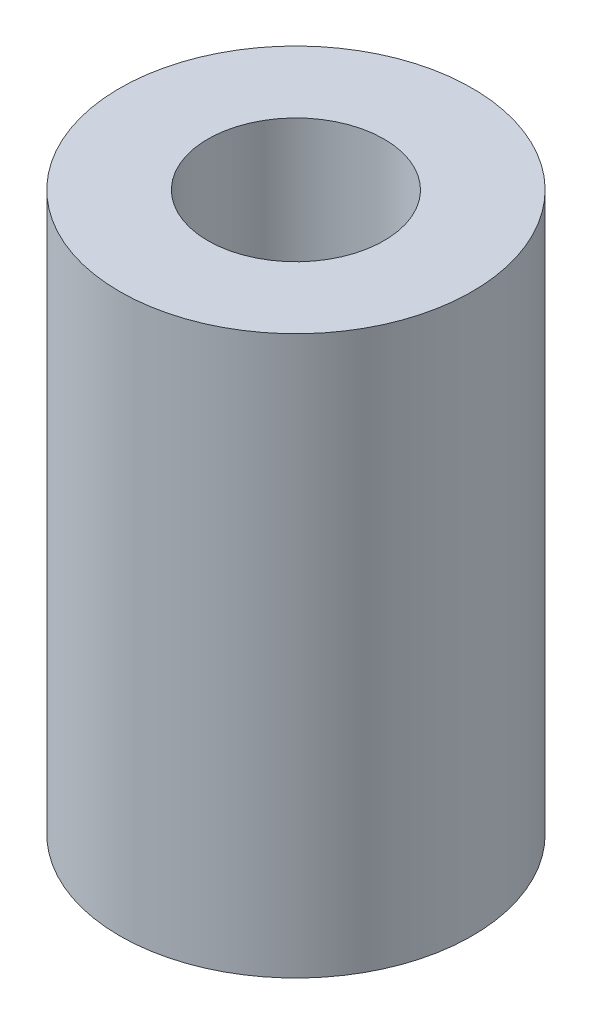
ISO-10303-21;
HEADER;
FILE_DESCRIPTION(('STEP AP214'),'2;1');
FILE_NAME('part.step','',(''),(''),'','','');
FILE_SCHEMA(('AUTOMOTIVE_DESIGN { 1 0 10303 214 1 1 1 1 }'));
ENDSEC;
DATA;
#1=APPLICATION_CONTEXT('core data for automotive mechanical design processes');
#2=APPLICATION_PROTOCOL_DEFINITION('international standard','automotive_design',2000,#1);
#3=PRODUCT_CONTEXT('',#1,'mechanical');
#4=PRODUCT('Part','Part','',(#3));
#5=PRODUCT_RELATED_PRODUCT_CATEGORY('part','',(#4));
#6=PRODUCT_DEFINITION_FORMATION('','',#4);
#7=PRODUCT_DEFINITION_CONTEXT('part definition',#1,'design');
#8=PRODUCT_DEFINITION('design','',#6,#7);
#9=PRODUCT_DEFINITION_SHAPE('','',#8);
#10=(LENGTH_UNIT() NAMED_UNIT(*) SI_UNIT(.MILLI.,.METRE.));
#11=(NAMED_UNIT(*) PLANE_ANGLE_UNIT() SI_UNIT($,.RADIAN.));
#12=(NAMED_UNIT(*) SI_UNIT($,.STERADIAN.) SOLID_ANGLE_UNIT());
#13=UNCERTAINTY_MEASURE_WITH_UNIT(LENGTH_MEASURE(1.E-05),#10,'distance_accuracy_value','');
#14=(GEOMETRIC_REPRESENTATION_CONTEXT(3) GLOBAL_UNCERTAINTY_ASSIGNED_CONTEXT((#13)) GLOBAL_UNIT_ASSIGNED_CONTEXT((#10,
#11,#12)) REPRESENTATION_CONTEXT('',''));
#15=CARTESIAN_POINT('',(0.,0.,0.));
#16=DIRECTION('',(0.,0.,1.));
#17=DIRECTION('',(1.,0.,0.));
#18=AXIS2_PLACEMENT_3D('',#15,#16,#17);
#19=CARTESIAN_POINT('',(0.,19.,0.));
#20=DIRECTION('',(0.,1.,0.));
#21=DIRECTION('',(0.,0.,1.));
#22=AXIS2_PLACEMENT_3D('',#19,#20,#21);
#23=PLANE('',#22);
#24=CARTESIAN_POINT('',(0.,19.,0.));
#25=DIRECTION('',(0.,1.,0.));
#26=DIRECTION('',(0.,0.,1.));
#27=AXIS2_PLACEMENT_3D('',#24,#25,#26);
#28=CIRCLE('',#27,6.);
#29=CARTESIAN_POINT('',(0.,19.,6.));
#30=VERTEX_POINT('',#29);
#31=EDGE_CURVE('E10',#30,#30,#28,.T.);
#32=ORIENTED_EDGE('',*,*,#31,.T.);
#33=EDGE_LOOP('',(#32));
#34=FACE_BOUND('',#33,.T.);
#35=CARTESIAN_POINT('',(0.,19.,0.));
#36=DIRECTION('',(0.,1.,0.));
#37=DIRECTION('',(0.,0.,1.));
#38=AXIS2_PLACEMENT_3D('',#35,#36,#37);
#39=CIRCLE('',#38,3.);
#40=CARTESIAN_POINT('',(0.,19.,3.));
#41=VERTEX_POINT('',#40);
#42=EDGE_CURVE('E45',#41,#41,#39,.T.);
#43=ORIENTED_EDGE('',*,*,#42,.F.);
#44=EDGE_LOOP('',(#43));
#45=FACE_BOUND('',#44,.T.);
#46=ADVANCED_FACE('F34',(#34,#45),#23,.T.);
#47=CARTESIAN_POINT('',(0.,0.,0.));
#48=DIRECTION('',(0.,1.,0.));
#49=DIRECTION('',(0.,0.,1.));
#50=AXIS2_PLACEMENT_3D('',#47,#48,#49);
#51=PLANE('',#50);
#52=CARTESIAN_POINT('',(0.,0.,0.));
#53=DIRECTION('',(0.,1.,0.));
#54=DIRECTION('',(0.,0.,1.));
#55=AXIS2_PLACEMENT_3D('',#52,#53,#54);
#56=CIRCLE('',#55,6.);
#57=CARTESIAN_POINT('',(0.,0.,6.));
#58=VERTEX_POINT('',#57);
#59=EDGE_CURVE('E38',#58,#58,#56,.T.);
#60=ORIENTED_EDGE('',*,*,#59,.F.);
#61=EDGE_LOOP('',(#60));
#62=FACE_BOUND('',#61,.T.);
#63=CARTESIAN_POINT('',(0.,0.,0.));
#64=DIRECTION('',(0.,1.,0.));
#65=DIRECTION('',(0.,0.,1.));
#66=AXIS2_PLACEMENT_3D('',#63,#64,#65);
#67=CIRCLE('',#66,3.);
#68=CARTESIAN_POINT('',(0.,0.,3.));
#69=VERTEX_POINT('',#68);
#70=EDGE_CURVE('E47',#69,#69,#67,.T.);
#71=ORIENTED_EDGE('',*,*,#70,.T.);
#72=EDGE_LOOP('',(#71));
#73=FACE_BOUND('',#72,.T.);
#74=ADVANCED_FACE('F57',(#62,#73),#51,.F.);
#75=CARTESIAN_POINT('',(0.,19.,0.));
#76=DIRECTION('',(0.,-1.,0.));
#77=DIRECTION('',(0.,0.,-1.));
#78=AXIS2_PLACEMENT_3D('',#75,#76,#77);
#79=CYLINDRICAL_SURFACE('',#78,6.);
#80=ORIENTED_EDGE('',*,*,#31,.F.);
#81=EDGE_LOOP('',(#80));
#82=FACE_BOUND('',#81,.T.);
#83=ORIENTED_EDGE('',*,*,#59,.T.);
#84=EDGE_LOOP('',(#83));
#85=FACE_BOUND('',#84,.T.);
#86=ADVANCED_FACE('F36',(#82,#85),#79,.T.);
#87=CARTESIAN_POINT('',(0.,19.,0.));
#88=DIRECTION('',(0.,-1.,0.));
#89=DIRECTION('',(0.,0.,-1.));
#90=AXIS2_PLACEMENT_3D('',#87,#88,#89);
#91=CYLINDRICAL_SURFACE('',#90,3.);
#92=ORIENTED_EDGE('',*,*,#42,.T.);
#93=EDGE_LOOP('',(#92));
#94=FACE_BOUND('',#93,.T.);
#95=ORIENTED_EDGE('',*,*,#70,.F.);
#96=EDGE_LOOP('',(#95));
#97=FACE_BOUND('',#96,.T.);
#98=ADVANCED_FACE('F53',(#94,#97),#91,.F.);
#99=CLOSED_SHELL('',(#46,#74,#86,#98));
#100=MANIFOLD_SOLID_BREP('B2',#99);
#101=ADVANCED_BREP_SHAPE_REPRESENTATION('',(#18,#100),#14);
#102=SHAPE_DEFINITION_REPRESENTATION(#9,#101);
ENDSEC;
END-ISO-10303-21;
